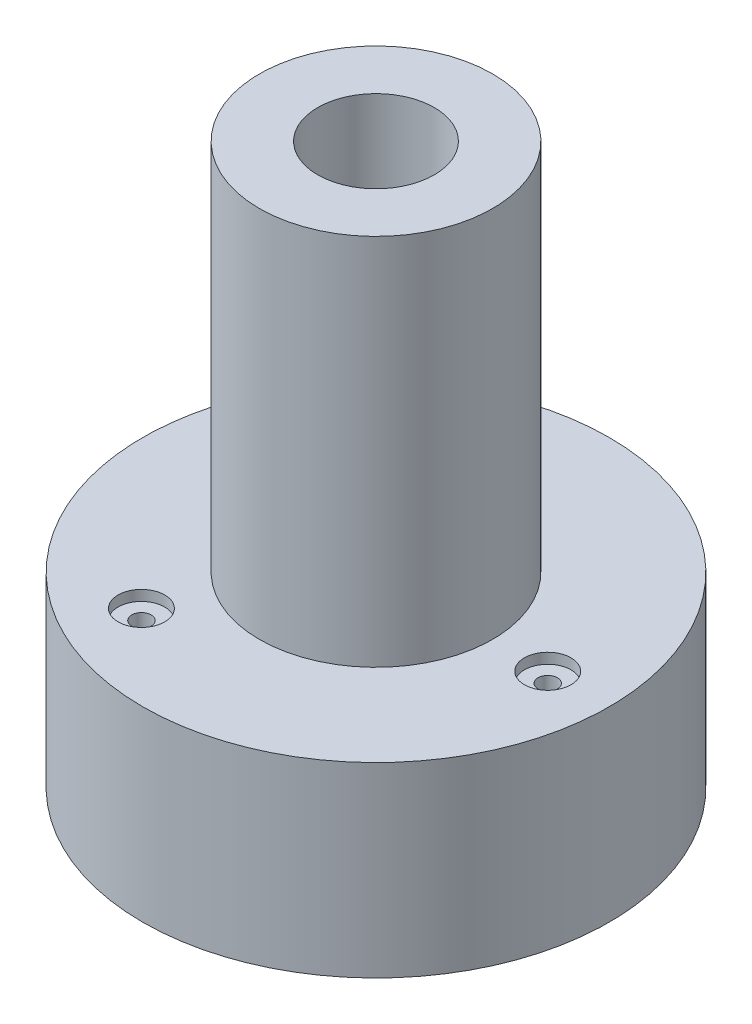
ISO-10303-21;
HEADER;
FILE_DESCRIPTION(('STEP AP214'),'2;1');
FILE_NAME('part.step','',(''),(''),'','','');
FILE_SCHEMA(('AUTOMOTIVE_DESIGN { 1 0 10303 214 1 1 1 1 }'));
ENDSEC;
DATA;
#1=APPLICATION_CONTEXT('core data for automotive mechanical design processes');
#2=APPLICATION_PROTOCOL_DEFINITION('international standard','automotive_design',2000,#1);
#3=PRODUCT_CONTEXT('',#1,'mechanical');
#4=PRODUCT('Part','Part','',(#3));
#5=PRODUCT_RELATED_PRODUCT_CATEGORY('part','',(#4));
#6=PRODUCT_DEFINITION_FORMATION('','',#4);
#7=PRODUCT_DEFINITION_CONTEXT('part definition',#1,'design');
#8=PRODUCT_DEFINITION('design','',#6,#7);
#9=PRODUCT_DEFINITION_SHAPE('','',#8);
#10=(LENGTH_UNIT() NAMED_UNIT(*) SI_UNIT(.MILLI.,.METRE.));
#11=(NAMED_UNIT(*) PLANE_ANGLE_UNIT() SI_UNIT($,.RADIAN.));
#12=(NAMED_UNIT(*) SI_UNIT($,.STERADIAN.) SOLID_ANGLE_UNIT());
#13=UNCERTAINTY_MEASURE_WITH_UNIT(LENGTH_MEASURE(1.E-05),#10,'distance_accuracy_value','');
#14=(GEOMETRIC_REPRESENTATION_CONTEXT(3) GLOBAL_UNCERTAINTY_ASSIGNED_CONTEXT((#13)) GLOBAL_UNIT_ASSIGNED_CONTEXT((#10,
#11,#12)) REPRESENTATION_CONTEXT('',''));
#15=CARTESIAN_POINT('',(0.,0.,0.));
#16=DIRECTION('',(0.,0.,1.));
#17=DIRECTION('',(1.,0.,0.));
#18=AXIS2_PLACEMENT_3D('',#15,#16,#17);
#19=CARTESIAN_POINT('',(0.,25.4,0.));
#20=DIRECTION('',(0.,-1.,0.));
#21=DIRECTION('',(0.,0.,-1.));
#22=AXIS2_PLACEMENT_3D('',#19,#20,#21);
#23=CYLINDRICAL_SURFACE('',#22,7.9375);
#24=CARTESIAN_POINT('',(0.,25.4,0.));
#25=DIRECTION('',(0.,1.,0.));
#26=DIRECTION('',(0.,0.,1.));
#27=AXIS2_PLACEMENT_3D('',#24,#25,#26);
#28=CIRCLE('',#27,7.9375);
#29=CARTESIAN_POINT('',(0.,25.4,7.9375));
#30=VERTEX_POINT('',#29);
#31=EDGE_CURVE('E10',#30,#30,#28,.T.);
#32=ORIENTED_EDGE('',*,*,#31,.F.);
#33=EDGE_LOOP('',(#32));
#34=FACE_BOUND('',#33,.T.);
#35=CARTESIAN_POINT('',(0.,0.,0.));
#36=DIRECTION('',(0.,1.,0.));
#37=DIRECTION('',(0.,0.,1.));
#38=AXIS2_PLACEMENT_3D('',#35,#36,#37);
#39=CIRCLE('',#38,7.9375);
#40=CARTESIAN_POINT('',(0.,0.,7.9375));
#41=VERTEX_POINT('',#40);
#42=EDGE_CURVE('E45',#41,#41,#39,.T.);
#43=ORIENTED_EDGE('',*,*,#42,.T.);
#44=EDGE_LOOP('',(#43));
#45=FACE_BOUND('',#44,.T.);
#46=ADVANCED_FACE('F42',(#34,#45),#23,.T.);
#47=CARTESIAN_POINT('',(0.,25.4,0.));
#48=DIRECTION('',(0.,1.,0.));
#49=DIRECTION('',(0.,0.,1.));
#50=AXIS2_PLACEMENT_3D('',#47,#48,#49);
#51=PLANE('',#50);
#52=CARTESIAN_POINT('',(0.,25.4,0.));
#53=DIRECTION('',(0.,1.,0.));
#54=DIRECTION('',(0.,0.,1.));
#55=AXIS2_PLACEMENT_3D('',#52,#53,#54);
#56=CIRCLE('',#55,3.96875);
#57=CARTESIAN_POINT('',(0.,25.4,3.96875));
#58=VERTEX_POINT('',#57);
#59=EDGE_CURVE('E65',#58,#58,#56,.T.);
#60=ORIENTED_EDGE('',*,*,#59,.F.);
#61=EDGE_LOOP('',(#60));
#62=FACE_BOUND('',#61,.T.);
#63=ORIENTED_EDGE('',*,*,#31,.T.);
#64=EDGE_LOOP('',(#63));
#65=FACE_BOUND('',#64,.T.);
#66=ADVANCED_FACE('F140',(#62,#65),#51,.T.);
#67=CARTESIAN_POINT('',(0.,-12.7,0.));
#68=DIRECTION('',(0.,1.,0.));
#69=DIRECTION('',(0.,0.,1.));
#70=AXIS2_PLACEMENT_3D('',#67,#68,#69);
#71=CYLINDRICAL_SURFACE('',#70,15.875);
#72=CARTESIAN_POINT('',(0.,-12.7,0.));
#73=DIRECTION('',(0.,-1.,0.));
#74=DIRECTION('',(0.,0.,-1.));
#75=AXIS2_PLACEMENT_3D('',#72,#73,#74);
#76=CIRCLE('',#75,15.875);
#77=CARTESIAN_POINT('',(0.,-12.7,-15.875));
#78=VERTEX_POINT('',#77);
#79=EDGE_CURVE('E55',#78,#78,#76,.T.);
#80=ORIENTED_EDGE('',*,*,#79,.F.);
#81=EDGE_LOOP('',(#80));
#82=FACE_BOUND('',#81,.T.);
#83=CARTESIAN_POINT('',(0.,0.,0.));
#84=DIRECTION('',(0.,-1.,0.));
#85=DIRECTION('',(0.,0.,-1.));
#86=AXIS2_PLACEMENT_3D('',#83,#84,#85);
#87=CIRCLE('',#86,15.875);
#88=CARTESIAN_POINT('',(0.,0.,-15.875));
#89=VERTEX_POINT('',#88);
#90=EDGE_CURVE('E57',#89,#89,#87,.T.);
#91=ORIENTED_EDGE('',*,*,#90,.T.);
#92=EDGE_LOOP('',(#91));
#93=FACE_BOUND('',#92,.T.);
#94=ADVANCED_FACE('F138',(#82,#93),#71,.T.);
#95=CARTESIAN_POINT('',(0.,-12.7,0.));
#96=DIRECTION('',(0.,-1.,0.));
#97=DIRECTION('',(0.,0.,-1.));
#98=AXIS2_PLACEMENT_3D('',#95,#96,#97);
#99=PLANE('',#98);
#100=CARTESIAN_POINT('',(-5.84384699279477,-12.7,-10.1218399031794));
#101=DIRECTION('',(0.,1.,0.));
#102=DIRECTION('',(0.,0.,1.));
#103=AXIS2_PLACEMENT_3D('',#100,#101,#102);
#104=CIRCLE('',#103,0.660399999999997);
#105=CARTESIAN_POINT('',(-5.84384699279477,-12.7,-9.46143990317936));
#106=VERTEX_POINT('',#105);
#107=EDGE_CURVE('E104',#106,#106,#104,.T.);
#108=ORIENTED_EDGE('',*,*,#107,.T.);
#109=EDGE_LOOP('',(#108));
#110=FACE_BOUND('',#109,.T.);
#111=CARTESIAN_POINT('',(-5.84384699279491,-12.7,10.1218399031793));
#112=DIRECTION('',(0.,1.,0.));
#113=DIRECTION('',(0.,0.,1.));
#114=AXIS2_PLACEMENT_3D('',#111,#112,#113);
#115=CIRCLE('',#114,0.660399999999997);
#116=CARTESIAN_POINT('',(-5.84384699279491,-12.7,10.7822399031793));
#117=VERTEX_POINT('',#116);
#118=EDGE_CURVE('E88',#117,#117,#115,.T.);
#119=ORIENTED_EDGE('',*,*,#118,.T.);
#120=EDGE_LOOP('',(#119));
#121=FACE_BOUND('',#120,.T.);
#122=CARTESIAN_POINT('',(11.6876939855897,-12.7,0.));
#123=DIRECTION('',(0.,1.,0.));
#124=DIRECTION('',(0.,0.,1.));
#125=AXIS2_PLACEMENT_3D('',#122,#123,#124);
#126=CIRCLE('',#125,0.660399999999997);
#127=CARTESIAN_POINT('',(11.6876939855897,-12.7,0.660399999999997));
#128=VERTEX_POINT('',#127);
#129=EDGE_CURVE('E69',#128,#128,#126,.T.);
#130=ORIENTED_EDGE('',*,*,#129,.T.);
#131=EDGE_LOOP('',(#130));
#132=FACE_BOUND('',#131,.T.);
#133=ORIENTED_EDGE('',*,*,#79,.T.);
#134=EDGE_LOOP('',(#133));
#135=FACE_BOUND('',#134,.T.);
#136=ADVANCED_FACE('F128',(#110,#121,#132,#135),#99,.T.);
#137=CARTESIAN_POINT('',(0.,0.,0.));
#138=DIRECTION('',(0.,-1.,0.));
#139=DIRECTION('',(0.,0.,-1.));
#140=AXIS2_PLACEMENT_3D('',#137,#138,#139);
#141=PLANE('',#140);
#142=CARTESIAN_POINT('',(-5.84384699279477,0.,-10.1218399031794));
#143=DIRECTION('',(0.,1.,0.));
#144=DIRECTION('',(0.,0.,1.));
#145=AXIS2_PLACEMENT_3D('',#142,#143,#144);
#146=CIRCLE('',#145,1.5875);
#147=CARTESIAN_POINT('',(-5.84384699279477,0.,-8.53433990317936));
#148=VERTEX_POINT('',#147);
#149=EDGE_CURVE('E116',#148,#148,#146,.T.);
#150=ORIENTED_EDGE('',*,*,#149,.F.);
#151=EDGE_LOOP('',(#150));
#152=FACE_BOUND('',#151,.T.);
#153=CARTESIAN_POINT('',(-5.84384699279491,0.,10.1218399031793));
#154=DIRECTION('',(0.,1.,0.));
#155=DIRECTION('',(0.,0.,1.));
#156=AXIS2_PLACEMENT_3D('',#153,#154,#155);
#157=CIRCLE('',#156,1.5875);
#158=CARTESIAN_POINT('',(-5.84384699279491,0.,11.7093399031793));
#159=VERTEX_POINT('',#158);
#160=EDGE_CURVE('E100',#159,#159,#157,.T.);
#161=ORIENTED_EDGE('',*,*,#160,.F.);
#162=EDGE_LOOP('',(#161));
#163=FACE_BOUND('',#162,.T.);
#164=CARTESIAN_POINT('',(11.6876939855897,0.,0.));
#165=DIRECTION('',(0.,1.,0.));
#166=DIRECTION('',(0.,0.,1.));
#167=AXIS2_PLACEMENT_3D('',#164,#165,#166);
#168=CIRCLE('',#167,1.5875);
#169=CARTESIAN_POINT('',(11.6876939855897,0.,1.5875));
#170=VERTEX_POINT('',#169);
#171=EDGE_CURVE('E84',#170,#170,#168,.T.);
#172=ORIENTED_EDGE('',*,*,#171,.F.);
#173=EDGE_LOOP('',(#172));
#174=FACE_BOUND('',#173,.T.);
#175=ORIENTED_EDGE('',*,*,#42,.F.);
#176=EDGE_LOOP('',(#175));
#177=FACE_BOUND('',#176,.T.);
#178=ORIENTED_EDGE('',*,*,#90,.F.);
#179=EDGE_LOOP('',(#178));
#180=FACE_BOUND('',#179,.T.);
#181=ADVANCED_FACE('F124',(#152,#163,#174,#177,#180),#141,.F.);
#182=CARTESIAN_POINT('',(0.,6.35,0.));
#183=DIRECTION('',(0.,1.,0.));
#184=DIRECTION('',(0.,0.,1.));
#185=AXIS2_PLACEMENT_3D('',#182,#183,#184);
#186=CYLINDRICAL_SURFACE('',#185,3.96875);
#187=CARTESIAN_POINT('',(0.,6.35,0.));
#188=DIRECTION('',(0.,1.,0.));
#189=DIRECTION('',(0.,0.,1.));
#190=AXIS2_PLACEMENT_3D('',#187,#188,#189);
#191=CIRCLE('',#190,3.96875);
#192=CARTESIAN_POINT('',(0.,6.35,3.96875));
#193=VERTEX_POINT('',#192);
#194=EDGE_CURVE('E61',#193,#193,#191,.T.);
#195=CARTESIAN_POINT('',(0.,6.35,3.96875));
#196=CARTESIAN_POINT('',(0.,6.5484375,3.96875));
#197=CARTESIAN_POINT('',(0.,6.746875,3.96875));
#198=CARTESIAN_POINT('',(0.,7.14375,3.96875));
#199=CARTESIAN_POINT('',(0.,7.3421875,3.96875));
#200=CARTESIAN_POINT('',(0.,7.7390625,3.96875));
#201=CARTESIAN_POINT('',(0.,7.9375,3.96875));
#202=CARTESIAN_POINT('',(0.,8.334375,3.96875));
#203=CARTESIAN_POINT('',(0.,8.5328125,3.96875));
#204=CARTESIAN_POINT('',(0.,8.9296875,3.96875));
#205=CARTESIAN_POINT('',(0.,9.128125,3.96875));
#206=CARTESIAN_POINT('',(0.,9.525,3.96875));
#207=CARTESIAN_POINT('',(0.,9.7234375,3.96875));
#208=CARTESIAN_POINT('',(0.,10.1203125,3.96875));
#209=CARTESIAN_POINT('',(0.,10.31875,3.96875));
#210=CARTESIAN_POINT('',(0.,10.715625,3.96875));
#211=CARTESIAN_POINT('',(0.,10.9140625,3.96875));
#212=CARTESIAN_POINT('',(0.,11.3109375,3.96875));
#213=CARTESIAN_POINT('',(0.,11.509375,3.96875));
#214=CARTESIAN_POINT('',(0.,11.90625,3.96875));
#215=CARTESIAN_POINT('',(0.,12.1046875,3.96875));
#216=CARTESIAN_POINT('',(0.,12.5015625,3.96875));
#217=CARTESIAN_POINT('',(0.,12.7,3.96875));
#218=CARTESIAN_POINT('',(0.,13.096875,3.96875));
#219=CARTESIAN_POINT('',(0.,13.2953125,3.96875));
#220=CARTESIAN_POINT('',(0.,13.6921875,3.96875));
#221=CARTESIAN_POINT('',(0.,13.890625,3.96875));
#222=CARTESIAN_POINT('',(0.,14.2875,3.96875));
#223=CARTESIAN_POINT('',(0.,14.4859375,3.96875));
#224=CARTESIAN_POINT('',(0.,14.8828125,3.96875));
#225=CARTESIAN_POINT('',(0.,15.08125,3.96875));
#226=CARTESIAN_POINT('',(0.,15.478125,3.96875));
#227=CARTESIAN_POINT('',(0.,15.6765625,3.96875));
#228=CARTESIAN_POINT('',(0.,16.0734375,3.96875));
#229=CARTESIAN_POINT('',(0.,16.271875,3.96875));
#230=CARTESIAN_POINT('',(0.,16.66875,3.96875));
#231=CARTESIAN_POINT('',(0.,16.8671875,3.96875));
#232=CARTESIAN_POINT('',(0.,17.2640625,3.96875));
#233=CARTESIAN_POINT('',(0.,17.4625,3.96875));
#234=CARTESIAN_POINT('',(0.,17.859375,3.96875));
#235=CARTESIAN_POINT('',(0.,18.0578125,3.96875));
#236=CARTESIAN_POINT('',(0.,18.4546875,3.96875));
#237=CARTESIAN_POINT('',(0.,18.653125,3.96875));
#238=CARTESIAN_POINT('',(0.,19.05,3.96875));
#239=CARTESIAN_POINT('',(0.,19.2484375,3.96875));
#240=CARTESIAN_POINT('',(0.,19.6453125,3.96875));
#241=CARTESIAN_POINT('',(0.,19.84375,3.96875));
#242=CARTESIAN_POINT('',(0.,20.240625,3.96875));
#243=CARTESIAN_POINT('',(0.,20.4390625,3.96875));
#244=CARTESIAN_POINT('',(0.,20.8359375,3.96875));
#245=CARTESIAN_POINT('',(0.,21.034375,3.96875));
#246=CARTESIAN_POINT('',(0.,21.43125,3.96875));
#247=CARTESIAN_POINT('',(0.,21.6296875,3.96875));
#248=CARTESIAN_POINT('',(0.,22.0265625,3.96875));
#249=CARTESIAN_POINT('',(0.,22.225,3.96875));
#250=CARTESIAN_POINT('',(0.,22.621875,3.96875));
#251=CARTESIAN_POINT('',(0.,22.8203125,3.96875));
#252=CARTESIAN_POINT('',(0.,23.2171875,3.96875));
#253=CARTESIAN_POINT('',(0.,23.415625,3.96875));
#254=CARTESIAN_POINT('',(0.,23.8125,3.96875));
#255=CARTESIAN_POINT('',(0.,24.0109375,3.96875));
#256=CARTESIAN_POINT('',(0.,24.4078125,3.96875));
#257=CARTESIAN_POINT('',(0.,24.60625,3.96875));
#258=CARTESIAN_POINT('',(0.,25.003125,3.96875));
#259=CARTESIAN_POINT('',(0.,25.2015625,3.96875));
#260=CARTESIAN_POINT('',(0.,25.4,3.96875));
#261=B_SPLINE_CURVE_WITH_KNOTS('',3,(#195,#196,#197,#198,#199,#200,#201,#202,#203,#204,#205,
#206,#207,#208,#209,#210,#211,#212,#213,#214,#215,#216,#217,#218,#219,#220,#221,#222,#223,#224,
#225,#226,#227,#228,#229,#230,#231,#232,#233,#234,#235,#236,#237,#238,#239,#240,#241,#242,#243,
#244,#245,#246,#247,#248,#249,#250,#251,#252,#253,#254,#255,#256,#257,#258,#259,#260),
.UNSPECIFIED.,.F.,.F.,(4,2,2,2,2,2,2,2,2,2,2,2,2,2,2,2,2,2,2,2,2,2,2,2,2,2,2,2,2,2,2,2,4),(0.,
0.595312499999999,1.190625,1.7859375,2.38125,2.9765625,3.571875,4.1671875,4.7625,5.3578125,
5.953125,6.5484375,7.14375,7.7390625,8.334375,8.9296875,9.525,10.1203125,10.715625,11.3109375,
11.90625,12.5015625,13.096875,13.6921875,14.2875,14.8828125,15.478125,16.0734375,16.66875,
17.2640625,17.859375,18.4546875,19.05),.UNSPECIFIED.);
#262=EDGE_CURVE('BSEAM127',#193,#58,#261,.T.);
#263=ORIENTED_EDGE('',*,*,#194,.F.);
#264=ORIENTED_EDGE('',*,*,#59,.T.);
#265=ORIENTED_EDGE('',*,*,#262,.T.);
#266=ORIENTED_EDGE('',*,*,#262,.F.);
#267=EDGE_LOOP('',(#263,#265,#264,#266));
#268=FACE_BOUND('',#267,.T.);
#269=ADVANCED_FACE('F127',(#268),#186,.F.);
#270=CARTESIAN_POINT('',(0.,6.35,0.));
#271=DIRECTION('',(0.,1.,0.));
#272=DIRECTION('',(0.,0.,1.));
#273=AXIS2_PLACEMENT_3D('',#270,#271,#272);
#274=PLANE('',#273);
#275=ORIENTED_EDGE('',*,*,#194,.T.);
#276=EDGE_LOOP('',(#275));
#277=FACE_BOUND('',#276,.T.);
#278=ADVANCED_FACE('F187',(#277),#274,.T.);
#279=CARTESIAN_POINT('',(11.6876939855897,0.,0.));
#280=DIRECTION('',(0.,1.,0.));
#281=DIRECTION('',(0.,0.,1.));
#282=AXIS2_PLACEMENT_3D('',#279,#280,#281);
#283=CYLINDRICAL_SURFACE('',#282,0.660399999999999);
#284=ORIENTED_EDGE('',*,*,#129,.F.);
#285=EDGE_LOOP('',(#284));
#286=FACE_BOUND('',#285,.T.);
#287=CARTESIAN_POINT('',(11.6876939855897,-0.7112,0.));
#288=DIRECTION('',(0.,1.,0.));
#289=DIRECTION('',(0.,0.,1.));
#290=AXIS2_PLACEMENT_3D('',#287,#288,#289);
#291=CIRCLE('',#290,0.6604);
#292=CARTESIAN_POINT('',(11.6876939855897,-0.7112,0.6604));
#293=VERTEX_POINT('',#292);
#294=EDGE_CURVE('E76',#293,#293,#291,.T.);
#295=ORIENTED_EDGE('',*,*,#294,.T.);
#296=EDGE_LOOP('',(#295));
#297=FACE_BOUND('',#296,.T.);
#298=ADVANCED_FACE('F197',(#286,#297),#283,.F.);
#299=CARTESIAN_POINT('',(12.3480939855897,-0.711199999999999,0.));
#300=DIRECTION('',(0.,-1.,0.));
#301=DIRECTION('',(0.,0.,-1.));
#302=AXIS2_PLACEMENT_3D('',#299,#300,#301);
#303=PLANE('',#302);
#304=ORIENTED_EDGE('',*,*,#294,.F.);
#305=EDGE_LOOP('',(#304));
#306=FACE_BOUND('',#305,.T.);
#307=CARTESIAN_POINT('',(11.6876939855897,-0.711199999999999,0.));
#308=DIRECTION('',(0.,1.,0.));
#309=DIRECTION('',(0.,0.,1.));
#310=AXIS2_PLACEMENT_3D('',#307,#308,#309);
#311=CIRCLE('',#310,1.5875);
#312=CARTESIAN_POINT('',(11.6876939855897,-0.711199999999999,1.5875));
#313=VERTEX_POINT('',#312);
#314=EDGE_CURVE('E80',#313,#313,#311,.T.);
#315=ORIENTED_EDGE('',*,*,#314,.T.);
#316=EDGE_LOOP('',(#315));
#317=FACE_BOUND('',#316,.T.);
#318=ADVANCED_FACE('F207',(#306,#317),#303,.F.);
#319=CARTESIAN_POINT('',(11.6876939855897,0.,0.));
#320=DIRECTION('',(0.,1.,0.));
#321=DIRECTION('',(0.,0.,1.));
#322=AXIS2_PLACEMENT_3D('',#319,#320,#321);
#323=CYLINDRICAL_SURFACE('',#322,1.5875);
#324=ORIENTED_EDGE('',*,*,#314,.F.);
#325=EDGE_LOOP('',(#324));
#326=FACE_BOUND('',#325,.T.);
#327=ORIENTED_EDGE('',*,*,#171,.T.);
#328=EDGE_LOOP('',(#327));
#329=FACE_BOUND('',#328,.T.);
#330=ADVANCED_FACE('F217',(#326,#329),#323,.F.);
#331=CARTESIAN_POINT('',(-5.84384699279491,0.,10.1218399031793));
#332=DIRECTION('',(0.,1.,0.));
#333=DIRECTION('',(0.,0.,1.));
#334=AXIS2_PLACEMENT_3D('',#331,#332,#333);
#335=CYLINDRICAL_SURFACE('',#334,0.660399999999999);
#336=ORIENTED_EDGE('',*,*,#118,.F.);
#337=EDGE_LOOP('',(#336));
#338=FACE_BOUND('',#337,.T.);
#339=CARTESIAN_POINT('',(-5.84384699279491,-0.7112,10.1218399031793));
#340=DIRECTION('',(0.,1.,0.));
#341=DIRECTION('',(0.,0.,1.));
#342=AXIS2_PLACEMENT_3D('',#339,#340,#341);
#343=CIRCLE('',#342,0.660400000000001);
#344=CARTESIAN_POINT('',(-5.84384699279491,-0.7112,10.7822399031793));
#345=VERTEX_POINT('',#344);
#346=EDGE_CURVE('E92',#345,#345,#343,.T.);
#347=ORIENTED_EDGE('',*,*,#346,.T.);
#348=EDGE_LOOP('',(#347));
#349=FACE_BOUND('',#348,.T.);
#350=ADVANCED_FACE('F226',(#338,#349),#335,.F.);
#351=CARTESIAN_POINT('',(-5.18344699279491,-0.711199999999999,10.1218399031793));
#352=DIRECTION('',(0.,-1.,0.));
#353=DIRECTION('',(0.,0.,-1.));
#354=AXIS2_PLACEMENT_3D('',#351,#352,#353);
#355=PLANE('',#354);
#356=ORIENTED_EDGE('',*,*,#346,.F.);
#357=EDGE_LOOP('',(#356));
#358=FACE_BOUND('',#357,.T.);
#359=CARTESIAN_POINT('',(-5.84384699279491,-0.711199999999999,10.1218399031793));
#360=DIRECTION('',(0.,1.,0.));
#361=DIRECTION('',(0.,0.,1.));
#362=AXIS2_PLACEMENT_3D('',#359,#360,#361);
#363=CIRCLE('',#362,1.5875);
#364=CARTESIAN_POINT('',(-5.84384699279491,-0.711199999999999,11.7093399031793));
#365=VERTEX_POINT('',#364);
#366=EDGE_CURVE('E96',#365,#365,#363,.T.);
#367=ORIENTED_EDGE('',*,*,#366,.T.);
#368=EDGE_LOOP('',(#367));
#369=FACE_BOUND('',#368,.T.);
#370=ADVANCED_FACE('F235',(#358,#369),#355,.F.);
#371=CARTESIAN_POINT('',(-5.84384699279491,0.,10.1218399031793));
#372=DIRECTION('',(0.,1.,0.));
#373=DIRECTION('',(0.,0.,1.));
#374=AXIS2_PLACEMENT_3D('',#371,#372,#373);
#375=CYLINDRICAL_SURFACE('',#374,1.5875);
#376=ORIENTED_EDGE('',*,*,#366,.F.);
#377=EDGE_LOOP('',(#376));
#378=FACE_BOUND('',#377,.T.);
#379=ORIENTED_EDGE('',*,*,#160,.T.);
#380=EDGE_LOOP('',(#379));
#381=FACE_BOUND('',#380,.T.);
#382=ADVANCED_FACE('F245',(#378,#381),#375,.F.);
#383=CARTESIAN_POINT('',(-5.84384699279477,0.,-10.1218399031794));
#384=DIRECTION('',(0.,1.,0.));
#385=DIRECTION('',(0.,0.,1.));
#386=AXIS2_PLACEMENT_3D('',#383,#384,#385);
#387=CYLINDRICAL_SURFACE('',#386,0.660399999999999);
#388=ORIENTED_EDGE('',*,*,#107,.F.);
#389=EDGE_LOOP('',(#388));
#390=FACE_BOUND('',#389,.T.);
#391=CARTESIAN_POINT('',(-5.84384699279477,-0.7112,-10.1218399031794));
#392=DIRECTION('',(0.,1.,0.));
#393=DIRECTION('',(0.,0.,1.));
#394=AXIS2_PLACEMENT_3D('',#391,#392,#393);
#395=CIRCLE('',#394,0.660400000000001);
#396=CARTESIAN_POINT('',(-5.84384699279477,-0.7112,-9.46143990317936));
#397=VERTEX_POINT('',#396);
#398=EDGE_CURVE('E108',#397,#397,#395,.T.);
#399=ORIENTED_EDGE('',*,*,#398,.T.);
#400=EDGE_LOOP('',(#399));
#401=FACE_BOUND('',#400,.T.);
#402=ADVANCED_FACE('F255',(#390,#401),#387,.F.);
#403=CARTESIAN_POINT('',(-5.18344699279477,-0.711199999999999,-10.1218399031794));
#404=DIRECTION('',(0.,-1.,0.));
#405=DIRECTION('',(0.,0.,-1.));
#406=AXIS2_PLACEMENT_3D('',#403,#404,#405);
#407=PLANE('',#406);
#408=ORIENTED_EDGE('',*,*,#398,.F.);
#409=EDGE_LOOP('',(#408));
#410=FACE_BOUND('',#409,.T.);
#411=CARTESIAN_POINT('',(-5.84384699279477,-0.711199999999999,-10.1218399031794));
#412=DIRECTION('',(0.,1.,0.));
#413=DIRECTION('',(0.,0.,1.));
#414=AXIS2_PLACEMENT_3D('',#411,#412,#413);
#415=CIRCLE('',#414,1.5875);
#416=CARTESIAN_POINT('',(-5.84384699279477,-0.711199999999999,-8.53433990317936));
#417=VERTEX_POINT('',#416);
#418=EDGE_CURVE('E112',#417,#417,#415,.T.);
#419=ORIENTED_EDGE('',*,*,#418,.T.);
#420=EDGE_LOOP('',(#419));
#421=FACE_BOUND('',#420,.T.);
#422=ADVANCED_FACE('F265',(#410,#421),#407,.F.);
#423=CARTESIAN_POINT('',(-5.84384699279477,0.,-10.1218399031794));
#424=DIRECTION('',(0.,1.,0.));
#425=DIRECTION('',(0.,0.,1.));
#426=AXIS2_PLACEMENT_3D('',#423,#424,#425);
#427=CYLINDRICAL_SURFACE('',#426,1.5875);
#428=ORIENTED_EDGE('',*,*,#418,.F.);
#429=EDGE_LOOP('',(#428));
#430=FACE_BOUND('',#429,.T.);
#431=ORIENTED_EDGE('',*,*,#149,.T.);
#432=EDGE_LOOP('',(#431));
#433=FACE_BOUND('',#432,.T.);
#434=ADVANCED_FACE('F122',(#430,#433),#427,.F.);
#435=CLOSED_SHELL('',(#46,#66,#94,#136,#181,#269,#278,#298,#318,#330,#350,#370,#382,#402,#422,#434));
#436=MANIFOLD_SOLID_BREP('B2',#435);
#437=ADVANCED_BREP_SHAPE_REPRESENTATION('',(#18,#436),#14);
#438=SHAPE_DEFINITION_REPRESENTATION(#9,#437);
ENDSEC;
END-ISO-10303-21;
